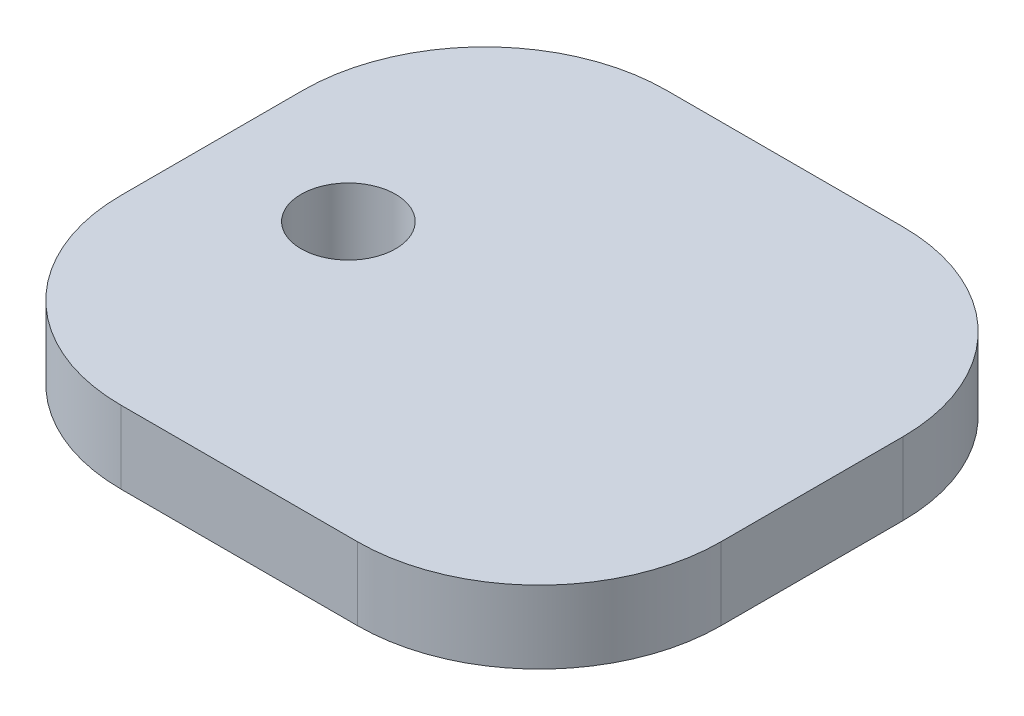
ISO-10303-21;
HEADER;
FILE_DESCRIPTION(('STEP AP214'),'2;1');
FILE_NAME('part.step','',(''),(''),'','','');
FILE_SCHEMA(('AUTOMOTIVE_DESIGN { 1 0 10303 214 1 1 1 1 }'));
ENDSEC;
DATA;
#1=APPLICATION_CONTEXT('core data for automotive mechanical design processes');
#2=APPLICATION_PROTOCOL_DEFINITION('international standard','automotive_design',2000,#1);
#3=PRODUCT_CONTEXT('',#1,'mechanical');
#4=PRODUCT('Part','Part','',(#3));
#5=PRODUCT_RELATED_PRODUCT_CATEGORY('part','',(#4));
#6=PRODUCT_DEFINITION_FORMATION('','',#4);
#7=PRODUCT_DEFINITION_CONTEXT('part definition',#1,'design');
#8=PRODUCT_DEFINITION('design','',#6,#7);
#9=PRODUCT_DEFINITION_SHAPE('','',#8);
#10=(LENGTH_UNIT() NAMED_UNIT(*) SI_UNIT(.MILLI.,.METRE.));
#11=(NAMED_UNIT(*) PLANE_ANGLE_UNIT() SI_UNIT($,.RADIAN.));
#12=(NAMED_UNIT(*) SI_UNIT($,.STERADIAN.) SOLID_ANGLE_UNIT());
#13=UNCERTAINTY_MEASURE_WITH_UNIT(LENGTH_MEASURE(1.E-05),#10,'distance_accuracy_value','');
#14=(GEOMETRIC_REPRESENTATION_CONTEXT(3) GLOBAL_UNCERTAINTY_ASSIGNED_CONTEXT((#13)) GLOBAL_UNIT_ASSIGNED_CONTEXT((#10,
#11,#12)) REPRESENTATION_CONTEXT('',''));
#15=CARTESIAN_POINT('',(0.,0.,0.));
#16=DIRECTION('',(0.,0.,1.));
#17=DIRECTION('',(1.,0.,0.));
#18=AXIS2_PLACEMENT_3D('',#15,#16,#17);
#19=CARTESIAN_POINT('',(0.,4.,0.));
#20=DIRECTION('',(0.,1.,0.));
#21=DIRECTION('',(0.,0.,1.));
#22=AXIS2_PLACEMENT_3D('',#19,#20,#21);
#23=PLANE('',#22);
#24=DIRECTION('',(-1.,0.,0.));
#25=VECTOR('',#24,1.);
#26=CARTESIAN_POINT('',(-19.5,4.,-15.));
#27=LINE('',#26,#25);
#28=CARTESIAN_POINT('',(3.5,4.,-15.));
#29=VERTEX_POINT('',#28);
#30=CARTESIAN_POINT('',(-9.50000000000001,4.,-15.));
#31=VERTEX_POINT('',#30);
#32=EDGE_CURVE('E203',#29,#31,#27,.T.);
#33=ORIENTED_EDGE('',*,*,#32,.T.);
#34=CARTESIAN_POINT('',(-9.50000000000001,4.,-5.));
#35=DIRECTION('',(0.,1.,0.));
#36=DIRECTION('',(0.,0.,1.));
#37=AXIS2_PLACEMENT_3D('',#34,#35,#36);
#38=CIRCLE('',#37,10.);
#39=CARTESIAN_POINT('',(-19.5,4.,-5.));
#40=VERTEX_POINT('',#39);
#41=EDGE_CURVE('E176',#31,#40,#38,.T.);
#42=ORIENTED_EDGE('',*,*,#41,.T.);
#43=DIRECTION('',(0.,0.,1.));
#44=VECTOR('',#43,1.);
#45=CARTESIAN_POINT('',(-19.5,4.,-15.));
#46=LINE('',#45,#44);
#47=CARTESIAN_POINT('',(-19.5,4.,5.));
#48=VERTEX_POINT('',#47);
#49=EDGE_CURVE('E133',#40,#48,#46,.T.);
#50=ORIENTED_EDGE('',*,*,#49,.T.);
#51=CARTESIAN_POINT('',(-9.50000000000001,4.,5.));
#52=DIRECTION('',(0.,1.,0.));
#53=DIRECTION('',(0.,0.,1.));
#54=AXIS2_PLACEMENT_3D('',#51,#52,#53);
#55=CIRCLE('',#54,10.);
#56=CARTESIAN_POINT('',(-9.50000000000001,4.,15.));
#57=VERTEX_POINT('',#56);
#58=EDGE_CURVE('E68',#48,#57,#55,.T.);
#59=ORIENTED_EDGE('',*,*,#58,.T.);
#60=DIRECTION('',(1.,0.,0.));
#61=VECTOR('',#60,1.);
#62=CARTESIAN_POINT('',(-19.5,4.,15.));
#63=LINE('',#62,#61);
#64=CARTESIAN_POINT('',(3.5,4.,15.));
#65=VERTEX_POINT('',#64);
#66=EDGE_CURVE('E154',#57,#65,#63,.T.);
#67=ORIENTED_EDGE('',*,*,#66,.T.);
#68=CARTESIAN_POINT('',(3.5,4.,5.));
#69=DIRECTION('',(0.,1.,0.));
#70=DIRECTION('',(0.,0.,1.));
#71=AXIS2_PLACEMENT_3D('',#68,#69,#70);
#72=CIRCLE('',#71,10.);
#73=CARTESIAN_POINT('',(13.5,4.,5.));
#74=VERTEX_POINT('',#73);
#75=EDGE_CURVE('E170',#65,#74,#72,.T.);
#76=ORIENTED_EDGE('',*,*,#75,.T.);
#77=DIRECTION('',(0.,0.,-1.));
#78=VECTOR('',#77,1.);
#79=CARTESIAN_POINT('',(13.5,4.,-15.));
#80=LINE('',#79,#78);
#81=CARTESIAN_POINT('',(13.5,4.,-5.));
#82=VERTEX_POINT('',#81);
#83=EDGE_CURVE('E147',#74,#82,#80,.T.);
#84=ORIENTED_EDGE('',*,*,#83,.T.);
#85=CARTESIAN_POINT('',(3.5,4.,-5.));
#86=DIRECTION('',(0.,1.,0.));
#87=DIRECTION('',(0.,0.,1.));
#88=AXIS2_PLACEMENT_3D('',#85,#86,#87);
#89=CIRCLE('',#88,10.);
#90=EDGE_CURVE('E173',#82,#29,#89,.T.);
#91=ORIENTED_EDGE('',*,*,#90,.T.);
#92=EDGE_LOOP('',(#33,#42,#50,#59,#67,#76,#84,#91));
#93=FACE_BOUND('',#92,.T.);
#94=CARTESIAN_POINT('',(-12.,4.,0.));
#95=DIRECTION('',(0.,1.,0.));
#96=DIRECTION('',(0.,0.,1.));
#97=AXIS2_PLACEMENT_3D('',#94,#95,#96);
#98=CIRCLE('',#97,2.6);
#99=CARTESIAN_POINT('',(-12.,4.,2.6));
#100=VERTEX_POINT('',#99);
#101=EDGE_CURVE('E216',#100,#100,#98,.T.);
#102=ORIENTED_EDGE('',*,*,#101,.F.);
#103=EDGE_LOOP('',(#102));
#104=FACE_BOUND('',#103,.T.);
#105=ADVANCED_FACE('F47',(#93,#104),#23,.T.);
#106=CARTESIAN_POINT('',(0.,0.,0.));
#107=DIRECTION('',(0.,1.,0.));
#108=DIRECTION('',(0.,0.,1.));
#109=AXIS2_PLACEMENT_3D('',#106,#107,#108);
#110=PLANE('',#109);
#111=DIRECTION('',(0.,0.,1.));
#112=VECTOR('',#111,1.);
#113=CARTESIAN_POINT('',(-19.5,0.,-15.));
#114=LINE('',#113,#112);
#115=CARTESIAN_POINT('',(-19.5,0.,-5.));
#116=VERTEX_POINT('',#115);
#117=CARTESIAN_POINT('',(-19.5,0.,5.));
#118=VERTEX_POINT('',#117);
#119=EDGE_CURVE('E131',#116,#118,#114,.T.);
#120=ORIENTED_EDGE('',*,*,#119,.F.);
#121=CARTESIAN_POINT('',(-9.50000000000001,0.,-5.));
#122=DIRECTION('',(0.,1.,0.));
#123=DIRECTION('',(0.,0.,1.));
#124=AXIS2_PLACEMENT_3D('',#121,#122,#123);
#125=CIRCLE('',#124,10.);
#126=CARTESIAN_POINT('',(-9.50000000000001,0.,-15.));
#127=VERTEX_POINT('',#126);
#128=EDGE_CURVE('E113',#116,#127,#125,.F.);
#129=ORIENTED_EDGE('',*,*,#128,.T.);
#130=DIRECTION('',(-1.,0.,0.));
#131=VECTOR('',#130,1.);
#132=CARTESIAN_POINT('',(-19.5,0.,-15.));
#133=LINE('',#132,#131);
#134=CARTESIAN_POINT('',(3.5,0.,-15.));
#135=VERTEX_POINT('',#134);
#136=EDGE_CURVE('E143',#135,#127,#133,.T.);
#137=ORIENTED_EDGE('',*,*,#136,.F.);
#138=CARTESIAN_POINT('',(3.5,0.,-5.));
#139=DIRECTION('',(0.,1.,0.));
#140=DIRECTION('',(0.,0.,1.));
#141=AXIS2_PLACEMENT_3D('',#138,#139,#140);
#142=CIRCLE('',#141,10.);
#143=CARTESIAN_POINT('',(13.5,0.,-5.));
#144=VERTEX_POINT('',#143);
#145=EDGE_CURVE('E125',#135,#144,#142,.F.);
#146=ORIENTED_EDGE('',*,*,#145,.T.);
#147=DIRECTION('',(0.,0.,-1.));
#148=VECTOR('',#147,1.);
#149=CARTESIAN_POINT('',(13.5,0.,-15.));
#150=LINE('',#149,#148);
#151=CARTESIAN_POINT('',(13.5,0.,5.));
#152=VERTEX_POINT('',#151);
#153=EDGE_CURVE('E149',#152,#144,#150,.T.);
#154=ORIENTED_EDGE('',*,*,#153,.F.);
#155=CARTESIAN_POINT('',(3.5,0.,5.));
#156=DIRECTION('',(0.,1.,0.));
#157=DIRECTION('',(0.,0.,1.));
#158=AXIS2_PLACEMENT_3D('',#155,#156,#157);
#159=CIRCLE('',#158,10.);
#160=CARTESIAN_POINT('',(3.5,0.,15.));
#161=VERTEX_POINT('',#160);
#162=EDGE_CURVE('E158',#152,#161,#159,.F.);
#163=ORIENTED_EDGE('',*,*,#162,.T.);
#164=DIRECTION('',(1.,0.,0.));
#165=VECTOR('',#164,1.);
#166=CARTESIAN_POINT('',(-19.5,0.,15.));
#167=LINE('',#166,#165);
#168=CARTESIAN_POINT('',(-9.50000000000001,0.,15.));
#169=VERTEX_POINT('',#168);
#170=EDGE_CURVE('E142',#169,#161,#167,.T.);
#171=ORIENTED_EDGE('',*,*,#170,.F.);
#172=CARTESIAN_POINT('',(-9.50000000000001,0.,5.));
#173=DIRECTION('',(0.,1.,0.));
#174=DIRECTION('',(0.,0.,1.));
#175=AXIS2_PLACEMENT_3D('',#172,#173,#174);
#176=CIRCLE('',#175,10.);
#177=EDGE_CURVE('E135',#169,#118,#176,.F.);
#178=ORIENTED_EDGE('',*,*,#177,.T.);
#179=EDGE_LOOP('',(#120,#129,#137,#146,#154,#163,#171,#178));
#180=FACE_BOUND('',#179,.T.);
#181=CARTESIAN_POINT('',(-12.,0.,0.));
#182=DIRECTION('',(0.,1.,0.));
#183=DIRECTION('',(0.,0.,1.));
#184=AXIS2_PLACEMENT_3D('',#181,#182,#183);
#185=CIRCLE('',#184,2.6);
#186=CARTESIAN_POINT('',(-12.,0.,2.6));
#187=VERTEX_POINT('',#186);
#188=EDGE_CURVE('E209',#187,#187,#185,.T.);
#189=ORIENTED_EDGE('',*,*,#188,.T.);
#190=EDGE_LOOP('',(#189));
#191=FACE_BOUND('',#190,.T.);
#192=ADVANCED_FACE('F138',(#180,#191),#110,.F.);
#193=CARTESIAN_POINT('',(13.5,4.,-15.));
#194=DIRECTION('',(-1.,0.,0.));
#195=DIRECTION('',(0.,0.,1.));
#196=AXIS2_PLACEMENT_3D('',#193,#194,#195);
#197=PLANE('',#196);
#198=ORIENTED_EDGE('',*,*,#153,.T.);
#199=DIRECTION('',(0.,-1.,0.));
#200=VECTOR('',#199,1.);
#201=CARTESIAN_POINT('',(13.5,4.,-5.));
#202=LINE('',#201,#200);
#203=EDGE_CURVE('E183',#144,#82,#202,.F.);
#204=ORIENTED_EDGE('',*,*,#203,.T.);
#205=ORIENTED_EDGE('',*,*,#83,.F.);
#206=DIRECTION('',(0.,-1.,0.));
#207=VECTOR('',#206,1.);
#208=CARTESIAN_POINT('',(13.5,4.,5.));
#209=LINE('',#208,#207);
#210=EDGE_CURVE('E179',#74,#152,#209,.T.);
#211=ORIENTED_EDGE('',*,*,#210,.T.);
#212=EDGE_LOOP('',(#198,#204,#205,#211));
#213=FACE_BOUND('',#212,.T.);
#214=ADVANCED_FACE('F198',(#213),#197,.F.);
#215=CARTESIAN_POINT('',(-19.5,4.,-15.));
#216=DIRECTION('',(0.,0.,1.));
#217=DIRECTION('',(1.,0.,0.));
#218=AXIS2_PLACEMENT_3D('',#215,#216,#217);
#219=PLANE('',#218);
#220=ORIENTED_EDGE('',*,*,#136,.T.);
#221=DIRECTION('',(0.,-1.,0.));
#222=VECTOR('',#221,1.);
#223=CARTESIAN_POINT('',(-9.50000000000001,4.,-15.));
#224=LINE('',#223,#222);
#225=EDGE_CURVE('E118',#127,#31,#224,.F.);
#226=ORIENTED_EDGE('',*,*,#225,.T.);
#227=ORIENTED_EDGE('',*,*,#32,.F.);
#228=DIRECTION('',(0.,-1.,0.));
#229=VECTOR('',#228,1.);
#230=CARTESIAN_POINT('',(3.5,4.,-15.));
#231=LINE('',#230,#229);
#232=EDGE_CURVE('E124',#29,#135,#231,.T.);
#233=ORIENTED_EDGE('',*,*,#232,.T.);
#234=EDGE_LOOP('',(#220,#226,#227,#233));
#235=FACE_BOUND('',#234,.T.);
#236=ADVANCED_FACE('F245',(#235),#219,.F.);
#237=CARTESIAN_POINT('',(-19.5,4.,-15.));
#238=DIRECTION('',(1.,0.,0.));
#239=DIRECTION('',(0.,0.,-1.));
#240=AXIS2_PLACEMENT_3D('',#237,#238,#239);
#241=PLANE('',#240);
#242=ORIENTED_EDGE('',*,*,#49,.F.);
#243=DIRECTION('',(0.,-1.,0.));
#244=VECTOR('',#243,1.);
#245=CARTESIAN_POINT('',(-19.5,4.,-5.));
#246=LINE('',#245,#244);
#247=EDGE_CURVE('E117',#40,#116,#246,.T.);
#248=ORIENTED_EDGE('',*,*,#247,.T.);
#249=ORIENTED_EDGE('',*,*,#119,.T.);
#250=DIRECTION('',(0.,-1.,0.));
#251=VECTOR('',#250,1.);
#252=CARTESIAN_POINT('',(-19.5,4.,5.));
#253=LINE('',#252,#251);
#254=EDGE_CURVE('E136',#118,#48,#253,.F.);
#255=ORIENTED_EDGE('',*,*,#254,.T.);
#256=EDGE_LOOP('',(#242,#248,#249,#255));
#257=FACE_BOUND('',#256,.T.);
#258=ADVANCED_FACE('F130',(#257),#241,.F.);
#259=CARTESIAN_POINT('',(-19.5,4.,15.));
#260=DIRECTION('',(0.,0.,-1.));
#261=DIRECTION('',(-1.,0.,0.));
#262=AXIS2_PLACEMENT_3D('',#259,#260,#261);
#263=PLANE('',#262);
#264=ORIENTED_EDGE('',*,*,#170,.T.);
#265=DIRECTION('',(0.,-1.,0.));
#266=VECTOR('',#265,1.);
#267=CARTESIAN_POINT('',(3.5,4.,15.));
#268=LINE('',#267,#266);
#269=EDGE_CURVE('E11',#161,#65,#268,.F.);
#270=ORIENTED_EDGE('',*,*,#269,.T.);
#271=ORIENTED_EDGE('',*,*,#66,.F.);
#272=DIRECTION('',(0.,-1.,0.));
#273=VECTOR('',#272,1.);
#274=CARTESIAN_POINT('',(-9.50000000000001,4.,15.));
#275=LINE('',#274,#273);
#276=EDGE_CURVE('E56',#57,#169,#275,.T.);
#277=ORIENTED_EDGE('',*,*,#276,.T.);
#278=EDGE_LOOP('',(#264,#270,#271,#277));
#279=FACE_BOUND('',#278,.T.);
#280=ADVANCED_FACE('F188',(#279),#263,.F.);
#281=CARTESIAN_POINT('',(-12.,4.,0.));
#282=DIRECTION('',(0.,-1.,0.));
#283=DIRECTION('',(0.,0.,-1.));
#284=AXIS2_PLACEMENT_3D('',#281,#282,#283);
#285=CYLINDRICAL_SURFACE('',#284,2.6);
#286=ORIENTED_EDGE('',*,*,#101,.T.);
#287=EDGE_LOOP('',(#286));
#288=FACE_BOUND('',#287,.T.);
#289=ORIENTED_EDGE('',*,*,#188,.F.);
#290=EDGE_LOOP('',(#289));
#291=FACE_BOUND('',#290,.T.);
#292=ADVANCED_FACE('F225',(#288,#291),#285,.F.);
#293=CARTESIAN_POINT('',(-9.50000000000001,4.,-5.));
#294=DIRECTION('',(0.,-1.,0.));
#295=DIRECTION('',(0.,0.,-1.));
#296=AXIS2_PLACEMENT_3D('',#293,#294,#295);
#297=CYLINDRICAL_SURFACE('',#296,10.);
#298=ORIENTED_EDGE('',*,*,#41,.F.);
#299=ORIENTED_EDGE('',*,*,#225,.F.);
#300=ORIENTED_EDGE('',*,*,#128,.F.);
#301=ORIENTED_EDGE('',*,*,#247,.F.);
#302=EDGE_LOOP('',(#298,#299,#300,#301));
#303=FACE_BOUND('',#302,.T.);
#304=ADVANCED_FACE('F116',(#303),#297,.T.);
#305=CARTESIAN_POINT('',(3.5,4.,-5.));
#306=DIRECTION('',(0.,-1.,0.));
#307=DIRECTION('',(0.,0.,-1.));
#308=AXIS2_PLACEMENT_3D('',#305,#306,#307);
#309=CYLINDRICAL_SURFACE('',#308,10.);
#310=ORIENTED_EDGE('',*,*,#90,.F.);
#311=ORIENTED_EDGE('',*,*,#203,.F.);
#312=ORIENTED_EDGE('',*,*,#145,.F.);
#313=ORIENTED_EDGE('',*,*,#232,.F.);
#314=EDGE_LOOP('',(#310,#311,#312,#313));
#315=FACE_BOUND('',#314,.T.);
#316=ADVANCED_FACE('F232',(#315),#309,.T.);
#317=CARTESIAN_POINT('',(3.5,4.,5.));
#318=DIRECTION('',(0.,-1.,0.));
#319=DIRECTION('',(0.,0.,-1.));
#320=AXIS2_PLACEMENT_3D('',#317,#318,#319);
#321=CYLINDRICAL_SURFACE('',#320,10.);
#322=ORIENTED_EDGE('',*,*,#75,.F.);
#323=ORIENTED_EDGE('',*,*,#269,.F.);
#324=ORIENTED_EDGE('',*,*,#162,.F.);
#325=ORIENTED_EDGE('',*,*,#210,.F.);
#326=EDGE_LOOP('',(#322,#323,#324,#325));
#327=FACE_BOUND('',#326,.T.);
#328=ADVANCED_FACE('F195',(#327),#321,.T.);
#329=CARTESIAN_POINT('',(-9.50000000000001,4.,5.));
#330=DIRECTION('',(0.,-1.,0.));
#331=DIRECTION('',(0.,0.,-1.));
#332=AXIS2_PLACEMENT_3D('',#329,#330,#331);
#333=CYLINDRICAL_SURFACE('',#332,10.);
#334=ORIENTED_EDGE('',*,*,#58,.F.);
#335=ORIENTED_EDGE('',*,*,#254,.F.);
#336=ORIENTED_EDGE('',*,*,#177,.F.);
#337=ORIENTED_EDGE('',*,*,#276,.F.);
#338=EDGE_LOOP('',(#334,#335,#336,#337));
#339=FACE_BOUND('',#338,.T.);
#340=ADVANCED_FACE('F49',(#339),#333,.T.);
#341=CLOSED_SHELL('',(#105,#192,#214,#236,#258,#280,#292,#304,#316,#328,#340));
#342=MANIFOLD_SOLID_BREP('B2',#341);
#343=ADVANCED_BREP_SHAPE_REPRESENTATION('',(#18,#342),#14);
#344=SHAPE_DEFINITION_REPRESENTATION(#9,#343);
ENDSEC;
END-ISO-10303-21;
